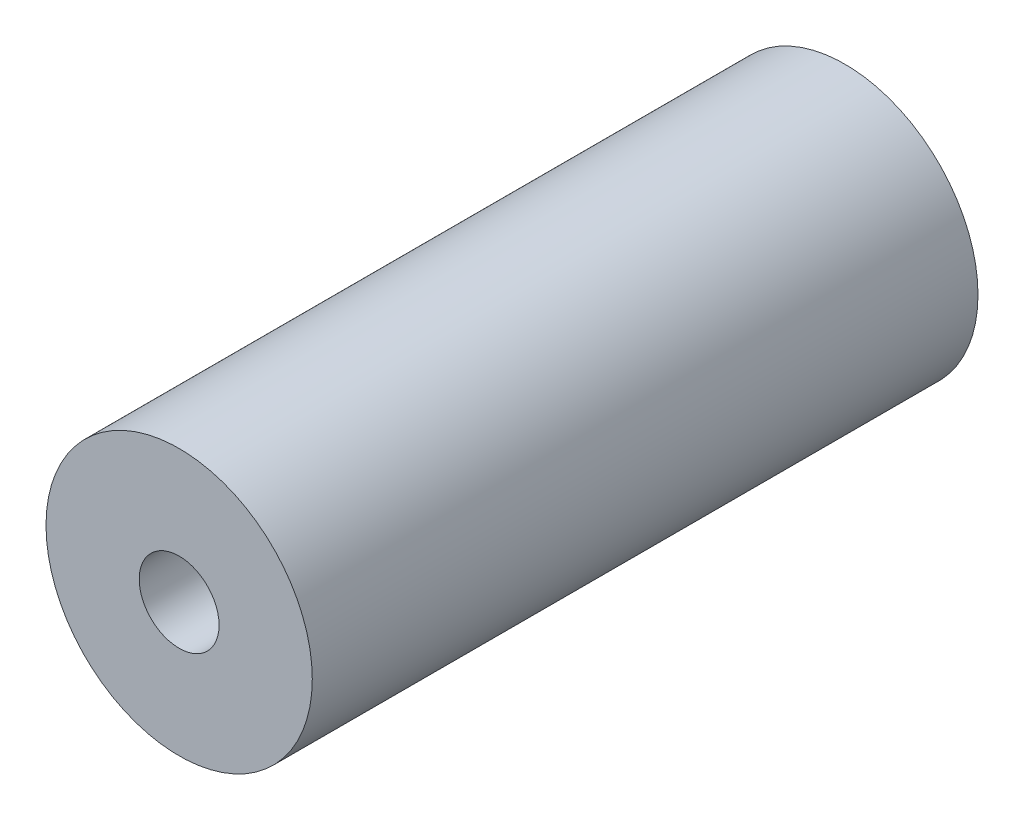
ISO-10303-21;
HEADER;
FILE_DESCRIPTION(('STEP AP214'),'2;1');
FILE_NAME('part.step','',(''),(''),'','','');
FILE_SCHEMA(('AUTOMOTIVE_DESIGN { 1 0 10303 214 1 1 1 1 }'));
ENDSEC;
DATA;
#1=APPLICATION_CONTEXT('core data for automotive mechanical design processes');
#2=APPLICATION_PROTOCOL_DEFINITION('international standard','automotive_design',2000,#1);
#3=PRODUCT_CONTEXT('',#1,'mechanical');
#4=PRODUCT('Part','Part','',(#3));
#5=PRODUCT_RELATED_PRODUCT_CATEGORY('part','',(#4));
#6=PRODUCT_DEFINITION_FORMATION('','',#4);
#7=PRODUCT_DEFINITION_CONTEXT('part definition',#1,'design');
#8=PRODUCT_DEFINITION('design','',#6,#7);
#9=PRODUCT_DEFINITION_SHAPE('','',#8);
#10=(LENGTH_UNIT() NAMED_UNIT(*) SI_UNIT(.MILLI.,.METRE.));
#11=(NAMED_UNIT(*) PLANE_ANGLE_UNIT() SI_UNIT($,.RADIAN.));
#12=(NAMED_UNIT(*) SI_UNIT($,.STERADIAN.) SOLID_ANGLE_UNIT());
#13=UNCERTAINTY_MEASURE_WITH_UNIT(LENGTH_MEASURE(1.E-05),#10,'distance_accuracy_value','');
#14=(GEOMETRIC_REPRESENTATION_CONTEXT(3) GLOBAL_UNCERTAINTY_ASSIGNED_CONTEXT((#13)) GLOBAL_UNIT_ASSIGNED_CONTEXT((#10,
#11,#12)) REPRESENTATION_CONTEXT('',''));
#15=CARTESIAN_POINT('',(0.,0.,0.));
#16=DIRECTION('',(0.,0.,1.));
#17=DIRECTION('',(1.,0.,0.));
#18=AXIS2_PLACEMENT_3D('',#15,#16,#17);
#19=CARTESIAN_POINT('',(0.,0.,50.));
#20=DIRECTION('',(0.,0.,-1.));
#21=DIRECTION('',(-1.,0.,0.));
#22=AXIS2_PLACEMENT_3D('',#19,#20,#21);
#23=CYLINDRICAL_SURFACE('',#22,10.);
#24=CARTESIAN_POINT('',(0.,0.,50.));
#25=DIRECTION('',(0.,0.,1.));
#26=DIRECTION('',(1.,0.,0.));
#27=AXIS2_PLACEMENT_3D('',#24,#25,#26);
#28=CIRCLE('',#27,10.);
#29=CARTESIAN_POINT('',(10.,0.,50.));
#30=VERTEX_POINT('',#29);
#31=EDGE_CURVE('E10',#30,#30,#28,.T.);
#32=ORIENTED_EDGE('',*,*,#31,.F.);
#33=EDGE_LOOP('',(#32));
#34=FACE_BOUND('',#33,.T.);
#35=CARTESIAN_POINT('',(0.,0.,0.));
#36=DIRECTION('',(0.,0.,1.));
#37=DIRECTION('',(1.,0.,0.));
#38=AXIS2_PLACEMENT_3D('',#35,#36,#37);
#39=CIRCLE('',#38,10.);
#40=CARTESIAN_POINT('',(10.,0.,0.));
#41=VERTEX_POINT('',#40);
#42=EDGE_CURVE('E36',#41,#41,#39,.T.);
#43=ORIENTED_EDGE('',*,*,#42,.T.);
#44=EDGE_LOOP('',(#43));
#45=FACE_BOUND('',#44,.T.);
#46=ADVANCED_FACE('F33',(#34,#45),#23,.T.);
#47=CARTESIAN_POINT('',(0.,0.,50.));
#48=DIRECTION('',(0.,0.,1.));
#49=DIRECTION('',(1.,0.,0.));
#50=AXIS2_PLACEMENT_3D('',#47,#48,#49);
#51=PLANE('',#50);
#52=CARTESIAN_POINT('',(0.,0.,50.));
#53=DIRECTION('',(0.,0.,1.));
#54=DIRECTION('',(1.,0.,0.));
#55=AXIS2_PLACEMENT_3D('',#52,#53,#54);
#56=CIRCLE('',#55,3.);
#57=CARTESIAN_POINT('',(3.,0.,50.));
#58=VERTEX_POINT('',#57);
#59=EDGE_CURVE('E45',#58,#58,#56,.T.);
#60=ORIENTED_EDGE('',*,*,#59,.F.);
#61=EDGE_LOOP('',(#60));
#62=FACE_BOUND('',#61,.T.);
#63=ORIENTED_EDGE('',*,*,#31,.T.);
#64=EDGE_LOOP('',(#63));
#65=FACE_BOUND('',#64,.T.);
#66=ADVANCED_FACE('F60',(#62,#65),#51,.T.);
#67=CARTESIAN_POINT('',(0.,0.,0.));
#68=DIRECTION('',(0.,0.,1.));
#69=DIRECTION('',(1.,0.,0.));
#70=AXIS2_PLACEMENT_3D('',#67,#68,#69);
#71=PLANE('',#70);
#72=ORIENTED_EDGE('',*,*,#42,.F.);
#73=EDGE_LOOP('',(#72));
#74=FACE_BOUND('',#73,.T.);
#75=ADVANCED_FACE('F56',(#74),#71,.F.);
#76=CARTESIAN_POINT('',(0.,0.,5.));
#77=DIRECTION('',(0.,0.,1.));
#78=DIRECTION('',(1.,0.,0.));
#79=AXIS2_PLACEMENT_3D('',#76,#77,#78);
#80=CYLINDRICAL_SURFACE('',#79,3.);
#81=CARTESIAN_POINT('',(0.,0.,5.));
#82=DIRECTION('',(0.,0.,1.));
#83=DIRECTION('',(1.,0.,0.));
#84=AXIS2_PLACEMENT_3D('',#81,#82,#83);
#85=CIRCLE('',#84,3.);
#86=CARTESIAN_POINT('',(3.,0.,5.));
#87=VERTEX_POINT('',#86);
#88=EDGE_CURVE('E43',#87,#87,#85,.T.);
#89=CARTESIAN_POINT('',(3.,0.,5.));
#90=CARTESIAN_POINT('',(3.,0.,5.46875));
#91=CARTESIAN_POINT('',(3.,0.,5.9375));
#92=CARTESIAN_POINT('',(3.,0.,6.875));
#93=CARTESIAN_POINT('',(3.,0.,7.34375));
#94=CARTESIAN_POINT('',(3.,0.,8.28125));
#95=CARTESIAN_POINT('',(3.,0.,8.75));
#96=CARTESIAN_POINT('',(3.,0.,9.6875));
#97=CARTESIAN_POINT('',(3.,0.,10.15625));
#98=CARTESIAN_POINT('',(3.,0.,11.09375));
#99=CARTESIAN_POINT('',(3.,0.,11.5625));
#100=CARTESIAN_POINT('',(3.,0.,12.5));
#101=CARTESIAN_POINT('',(3.,0.,12.96875));
#102=CARTESIAN_POINT('',(3.,0.,13.90625));
#103=CARTESIAN_POINT('',(3.,0.,14.375));
#104=CARTESIAN_POINT('',(3.,0.,15.3125));
#105=CARTESIAN_POINT('',(3.,0.,15.78125));
#106=CARTESIAN_POINT('',(3.,0.,16.71875));
#107=CARTESIAN_POINT('',(3.,0.,17.1875));
#108=CARTESIAN_POINT('',(3.,0.,18.125));
#109=CARTESIAN_POINT('',(3.,0.,18.59375));
#110=CARTESIAN_POINT('',(3.,0.,19.53125));
#111=CARTESIAN_POINT('',(3.,0.,20.));
#112=CARTESIAN_POINT('',(3.,0.,20.9375));
#113=CARTESIAN_POINT('',(3.,0.,21.40625));
#114=CARTESIAN_POINT('',(3.,0.,22.34375));
#115=CARTESIAN_POINT('',(3.,0.,22.8125));
#116=CARTESIAN_POINT('',(3.,0.,23.75));
#117=CARTESIAN_POINT('',(3.,0.,24.21875));
#118=CARTESIAN_POINT('',(3.,0.,25.15625));
#119=CARTESIAN_POINT('',(3.,0.,25.625));
#120=CARTESIAN_POINT('',(3.,0.,26.5625));
#121=CARTESIAN_POINT('',(3.,0.,27.03125));
#122=CARTESIAN_POINT('',(3.,0.,27.96875));
#123=CARTESIAN_POINT('',(3.,0.,28.4375));
#124=CARTESIAN_POINT('',(3.,0.,29.375));
#125=CARTESIAN_POINT('',(3.,0.,29.84375));
#126=CARTESIAN_POINT('',(3.,0.,30.78125));
#127=CARTESIAN_POINT('',(3.,0.,31.25));
#128=CARTESIAN_POINT('',(3.,0.,32.1875));
#129=CARTESIAN_POINT('',(3.,0.,32.65625));
#130=CARTESIAN_POINT('',(3.,0.,33.59375));
#131=CARTESIAN_POINT('',(3.,0.,34.0625));
#132=CARTESIAN_POINT('',(3.,0.,35.));
#133=CARTESIAN_POINT('',(3.,0.,35.46875));
#134=CARTESIAN_POINT('',(3.,0.,36.40625));
#135=CARTESIAN_POINT('',(3.,0.,36.875));
#136=CARTESIAN_POINT('',(3.,0.,37.8125));
#137=CARTESIAN_POINT('',(3.,0.,38.28125));
#138=CARTESIAN_POINT('',(3.,0.,39.21875));
#139=CARTESIAN_POINT('',(3.,0.,39.6875));
#140=CARTESIAN_POINT('',(3.,0.,40.625));
#141=CARTESIAN_POINT('',(3.,0.,41.09375));
#142=CARTESIAN_POINT('',(3.,0.,42.03125));
#143=CARTESIAN_POINT('',(3.,0.,42.5));
#144=CARTESIAN_POINT('',(3.,0.,43.4375));
#145=CARTESIAN_POINT('',(3.,0.,43.90625));
#146=CARTESIAN_POINT('',(3.,0.,44.84375));
#147=CARTESIAN_POINT('',(3.,0.,45.3125));
#148=CARTESIAN_POINT('',(3.,0.,46.25));
#149=CARTESIAN_POINT('',(3.,0.,46.71875));
#150=CARTESIAN_POINT('',(3.,0.,47.65625));
#151=CARTESIAN_POINT('',(3.,0.,48.125));
#152=CARTESIAN_POINT('',(3.,0.,49.0625));
#153=CARTESIAN_POINT('',(3.,0.,49.53125));
#154=CARTESIAN_POINT('',(3.,0.,50.));
#155=B_SPLINE_CURVE_WITH_KNOTS('',3,(#89,#90,#91,#92,#93,#94,#95,#96,#97,#98,#99,#100,#101,#102,
#103,#104,#105,#106,#107,#108,#109,#110,#111,#112,#113,#114,#115,#116,#117,#118,#119,#120,#121,
#122,#123,#124,#125,#126,#127,#128,#129,#130,#131,#132,#133,#134,#135,#136,#137,#138,#139,#140,
#141,#142,#143,#144,#145,#146,#147,#148,#149,#150,#151,#152,#153,#154),.UNSPECIFIED.,.F.,.F.,(4,
2,2,2,2,2,2,2,2,2,2,2,2,2,2,2,2,2,2,2,2,2,2,2,2,2,2,2,2,2,2,2,4),(0.,1.40625,2.8125,4.21875,
5.625,7.03125,8.4375,9.84375,11.25,12.65625,14.0625,15.46875,16.875,18.28125,19.6875,21.09375,
22.5,23.90625,25.3125,26.71875,28.125,29.53125,30.9375,32.34375,33.75,35.15625,36.5625,37.96875,
39.375,40.78125,42.1875,43.59375,45.),.UNSPECIFIED.);
#156=EDGE_CURVE('BSEAM53',#87,#58,#155,.T.);
#157=ORIENTED_EDGE('',*,*,#88,.F.);
#158=ORIENTED_EDGE('',*,*,#59,.T.);
#159=ORIENTED_EDGE('',*,*,#156,.T.);
#160=ORIENTED_EDGE('',*,*,#156,.F.);
#161=EDGE_LOOP('',(#157,#159,#158,#160));
#162=FACE_BOUND('',#161,.T.);
#163=ADVANCED_FACE('F53',(#162),#80,.F.);
#164=CARTESIAN_POINT('',(0.,0.,5.));
#165=DIRECTION('',(0.,0.,1.));
#166=DIRECTION('',(1.,0.,0.));
#167=AXIS2_PLACEMENT_3D('',#164,#165,#166);
#168=PLANE('',#167);
#169=ORIENTED_EDGE('',*,*,#88,.T.);
#170=EDGE_LOOP('',(#169));
#171=FACE_BOUND('',#170,.T.);
#172=ADVANCED_FACE('F51',(#171),#168,.T.);
#173=CLOSED_SHELL('',(#46,#66,#75,#163,#172));
#174=MANIFOLD_SOLID_BREP('B2',#173);
#175=ADVANCED_BREP_SHAPE_REPRESENTATION('',(#18,#174),#14);
#176=SHAPE_DEFINITION_REPRESENTATION(#9,#175);
ENDSEC;
END-ISO-10303-21;
